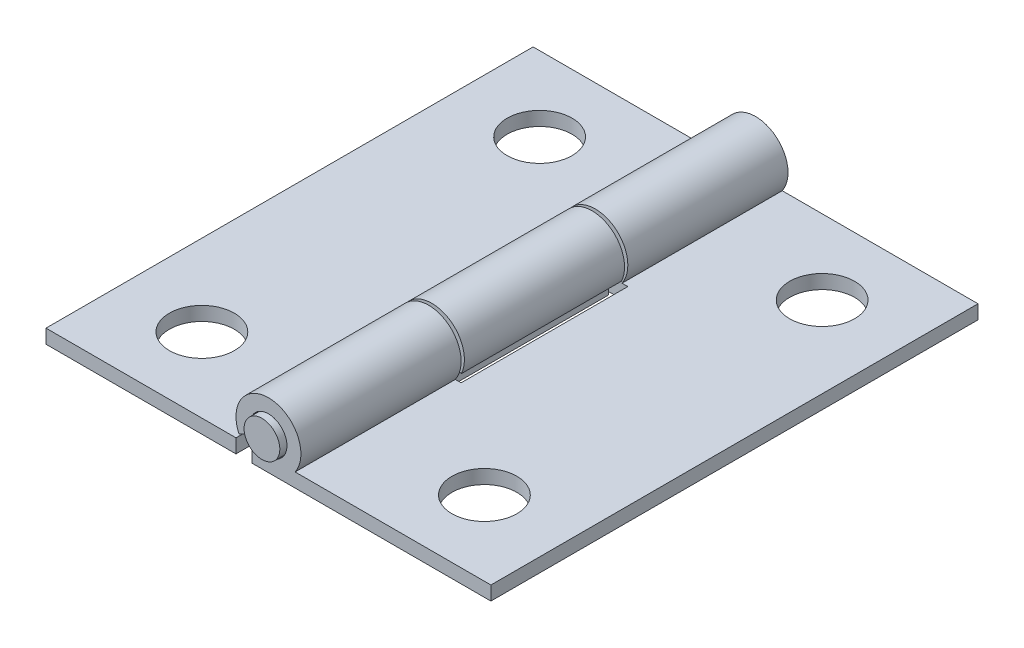
ISO-10303-21;
HEADER;
FILE_DESCRIPTION(('STEP AP214'),'2;1');
FILE_NAME('part.step','',(''),(''),'','','');
FILE_SCHEMA(('AUTOMOTIVE_DESIGN { 1 0 10303 214 1 1 1 1 }'));
ENDSEC;
DATA;
#1=APPLICATION_CONTEXT('core data for automotive mechanical design processes');
#2=APPLICATION_PROTOCOL_DEFINITION('international standard','automotive_design',2000,#1);
#3=PRODUCT_CONTEXT('',#1,'mechanical');
#4=PRODUCT('Part','Part','',(#3));
#5=PRODUCT_RELATED_PRODUCT_CATEGORY('part','',(#4));
#6=PRODUCT_DEFINITION_FORMATION('','',#4);
#7=PRODUCT_DEFINITION_CONTEXT('part definition',#1,'design');
#8=PRODUCT_DEFINITION('design','',#6,#7);
#9=PRODUCT_DEFINITION_SHAPE('','',#8);
#10=(LENGTH_UNIT() NAMED_UNIT(*) SI_UNIT(.MILLI.,.METRE.));
#11=(NAMED_UNIT(*) PLANE_ANGLE_UNIT() SI_UNIT($,.RADIAN.));
#12=(NAMED_UNIT(*) SI_UNIT($,.STERADIAN.) SOLID_ANGLE_UNIT());
#13=UNCERTAINTY_MEASURE_WITH_UNIT(LENGTH_MEASURE(1.E-05),#10,'distance_accuracy_value','');
#14=(GEOMETRIC_REPRESENTATION_CONTEXT(3) GLOBAL_UNCERTAINTY_ASSIGNED_CONTEXT((#13)) GLOBAL_UNIT_ASSIGNED_CONTEXT((#10,
#11,#12)) REPRESENTATION_CONTEXT('',''));
#15=CARTESIAN_POINT('',(0.,0.,0.));
#16=DIRECTION('',(0.,0.,1.));
#17=DIRECTION('',(1.,0.,0.));
#18=AXIS2_PLACEMENT_3D('',#15,#16,#17);
#19=CARTESIAN_POINT('',(0.,1.0922,0.));
#20=DIRECTION('',(0.,1.,0.));
#21=DIRECTION('',(0.,0.,1.));
#22=AXIS2_PLACEMENT_3D('',#19,#20,#21);
#23=PLANE('',#22);
#24=DIRECTION('',(1.,0.,0.));
#25=VECTOR('',#24,1.);
#26=CARTESIAN_POINT('',(0.,1.0922,-25.3153333333333));
#27=LINE('',#26,#25);
#28=CARTESIAN_POINT('',(17.399,1.0922,-25.3153333333333));
#29=VERTEX_POINT('',#28);
#30=CARTESIAN_POINT('',(18.669,1.0922,-25.3153333333333));
#31=VERTEX_POINT('',#30);
#32=EDGE_CURVE('E276',#29,#31,#27,.T.);
#33=ORIENTED_EDGE('',*,*,#32,.F.);
#34=DIRECTION('',(0.,0.,1.));
#35=VECTOR('',#34,1.);
#36=CARTESIAN_POINT('',(17.399,1.0922,-31.7735799096108));
#37=LINE('',#36,#35);
#38=CARTESIAN_POINT('',(17.399,1.0922,-12.7846666666667));
#39=VERTEX_POINT('',#38);
#40=EDGE_CURVE('E274',#29,#39,#37,.T.);
#41=ORIENTED_EDGE('',*,*,#40,.T.);
#42=DIRECTION('',(-1.,0.,0.));
#43=VECTOR('',#42,1.);
#44=CARTESIAN_POINT('',(0.,1.0922,-12.7846666666667));
#45=LINE('',#44,#43);
#46=CARTESIAN_POINT('',(18.669,1.0922,-12.7846666666667));
#47=VERTEX_POINT('',#46);
#48=EDGE_CURVE('E271',#47,#39,#45,.T.);
#49=ORIENTED_EDGE('',*,*,#48,.F.);
#50=DIRECTION('',(0.,0.,1.));
#51=VECTOR('',#50,1.);
#52=CARTESIAN_POINT('',(18.669,1.0922,0.));
#53=LINE('',#52,#51);
#54=EDGE_CURVE('E268',#31,#47,#53,.T.);
#55=ORIENTED_EDGE('',*,*,#54,.F.);
#56=EDGE_LOOP('',(#33,#41,#49,#55));
#57=FACE_BOUND('',#56,.T.);
#58=ADVANCED_FACE('F101',(#57),#23,.T.);
#59=CARTESIAN_POINT('',(0.,1.0922,0.));
#60=DIRECTION('',(0.,0.,-1.));
#61=DIRECTION('',(-1.,0.,0.));
#62=AXIS2_PLACEMENT_3D('',#59,#60,#61);
#63=PLANE('',#62);
#64=DIRECTION('',(1.,0.,0.));
#65=VECTOR('',#64,1.);
#66=CARTESIAN_POINT('',(0.,0.,0.));
#67=LINE('',#66,#65);
#68=CARTESIAN_POINT('',(0.,0.,0.));
#69=VERTEX_POINT('',#68);
#70=CARTESIAN_POINT('',(14.859,0.,0.));
#71=VERTEX_POINT('',#70);
#72=EDGE_CURVE('E221',#69,#71,#67,.T.);
#73=ORIENTED_EDGE('',*,*,#72,.T.);
#74=DIRECTION('',(0.,-1.,0.));
#75=VECTOR('',#74,1.);
#76=CARTESIAN_POINT('',(14.859,1.0922,0.));
#77=LINE('',#76,#75);
#78=CARTESIAN_POINT('',(14.859,1.0922,0.));
#79=VERTEX_POINT('',#78);
#80=EDGE_CURVE('E13',#79,#71,#77,.T.);
#81=ORIENTED_EDGE('',*,*,#80,.F.);
#82=DIRECTION('',(1.,0.,0.));
#83=VECTOR('',#82,1.);
#84=CARTESIAN_POINT('',(0.,1.0922,0.));
#85=LINE('',#84,#83);
#86=CARTESIAN_POINT('',(0.,1.0922,0.));
#87=VERTEX_POINT('',#86);
#88=EDGE_CURVE('E278',#87,#79,#85,.T.);
#89=ORIENTED_EDGE('',*,*,#88,.F.);
#90=DIRECTION('',(0.,-1.,0.));
#91=VECTOR('',#90,1.);
#92=CARTESIAN_POINT('',(0.,1.0922,0.));
#93=LINE('',#92,#91);
#94=EDGE_CURVE('E125',#87,#69,#93,.T.);
#95=ORIENTED_EDGE('',*,*,#94,.T.);
#96=EDGE_LOOP('',(#73,#81,#89,#95));
#97=FACE_BOUND('',#96,.T.);
#98=ADVANCED_FACE('F328',(#97),#63,.F.);
#99=CARTESIAN_POINT('',(14.859,1.0922,0.));
#100=DIRECTION('',(-1.,0.,0.));
#101=DIRECTION('',(0.,0.,1.));
#102=AXIS2_PLACEMENT_3D('',#99,#100,#101);
#103=PLANE('',#102);
#104=DIRECTION('',(0.,0.,-1.));
#105=VECTOR('',#104,1.);
#106=CARTESIAN_POINT('',(14.859,0.,0.));
#107=LINE('',#106,#105);
#108=CARTESIAN_POINT('',(14.859,0.,-12.7846666666667));
#109=VERTEX_POINT('',#108);
#110=EDGE_CURVE('E223',#71,#109,#107,.T.);
#111=ORIENTED_EDGE('',*,*,#110,.T.);
#112=DIRECTION('',(0.,-1.,0.));
#113=VECTOR('',#112,1.);
#114=CARTESIAN_POINT('',(14.859,1.0922,-12.7846666666667));
#115=LINE('',#114,#113);
#116=CARTESIAN_POINT('',(14.859,1.0922,-12.7846666666667));
#117=VERTEX_POINT('',#116);
#118=EDGE_CURVE('E109',#117,#109,#115,.T.);
#119=ORIENTED_EDGE('',*,*,#118,.F.);
#120=DIRECTION('',(0.,0.,-1.));
#121=VECTOR('',#120,1.);
#122=CARTESIAN_POINT('',(14.859,1.0922,0.));
#123=LINE('',#122,#121);
#124=EDGE_CURVE('E164',#79,#117,#123,.T.);
#125=ORIENTED_EDGE('',*,*,#124,.F.);
#126=ORIENTED_EDGE('',*,*,#80,.T.);
#127=EDGE_LOOP('',(#111,#119,#125,#126));
#128=FACE_BOUND('',#127,.T.);
#129=ADVANCED_FACE('F256',(#128),#103,.F.);
#130=CARTESIAN_POINT('',(0.,1.0922,-12.7846666666667));
#131=DIRECTION('',(0.,0.,1.));
#132=DIRECTION('',(1.,0.,0.));
#133=AXIS2_PLACEMENT_3D('',#130,#131,#132);
#134=PLANE('',#133);
#135=DIRECTION('',(-1.,0.,0.));
#136=VECTOR('',#135,1.);
#137=CARTESIAN_POINT('',(0.,0.,-12.7846666666667));
#138=LINE('',#137,#136);
#139=CARTESIAN_POINT('',(18.669,0.,-12.7846666666667));
#140=VERTEX_POINT('',#139);
#141=EDGE_CURVE('E226',#140,#109,#138,.T.);
#142=ORIENTED_EDGE('',*,*,#141,.F.);
#143=DIRECTION('',(0.,-1.,0.));
#144=VECTOR('',#143,1.);
#145=CARTESIAN_POINT('',(18.669,1.0922,-12.7846666666667));
#146=LINE('',#145,#144);
#147=EDGE_CURVE('E249',#47,#140,#146,.T.);
#148=ORIENTED_EDGE('',*,*,#147,.F.);
#149=ORIENTED_EDGE('',*,*,#48,.T.);
#150=CARTESIAN_POINT('',(17.399,2.54,-12.7846666666667));
#151=DIRECTION('',(0.,0.,1.));
#152=DIRECTION('',(1.,0.,0.));
#153=AXIS2_PLACEMENT_3D('',#150,#151,#152);
#154=CIRCLE('',#153,1.4478);
#155=CARTESIAN_POINT('',(18.7111524140717,1.92813328065182,-12.7846666666667));
#156=VERTEX_POINT('',#155);
#157=EDGE_CURVE('E116',#156,#39,#154,.T.);
#158=ORIENTED_EDGE('',*,*,#157,.F.);
#159=DIRECTION('',(0.906307787036649,-0.422618261740701,0.));
#160=VECTOR('',#159,1.);
#161=CARTESIAN_POINT('',(3.6621087619058,8.94561758356565,-12.7846666666667));
#162=LINE('',#161,#160);
#163=CARTESIAN_POINT('',(19.7010217790731,1.46654961517862,-12.7846666666667));
#164=VERTEX_POINT('',#163);
#165=EDGE_CURVE('E298',#156,#164,#162,.T.);
#166=ORIENTED_EDGE('',*,*,#165,.T.);
#167=CARTESIAN_POINT('',(17.399,2.54,-12.7846666666667));
#168=DIRECTION('',(0.,0.,1.));
#169=DIRECTION('',(1.,0.,0.));
#170=AXIS2_PLACEMENT_3D('',#167,#168,#169);
#171=CIRCLE('',#170,2.54);
#172=CARTESIAN_POINT('',(15.3120224821527,1.0922,-12.7846666666667));
#173=VERTEX_POINT('',#172);
#174=EDGE_CURVE('E301',#164,#173,#171,.T.);
#175=ORIENTED_EDGE('',*,*,#174,.T.);
#176=EDGE_CURVE('E255',#173,#117,#45,.T.);
#177=ORIENTED_EDGE('',*,*,#176,.T.);
#178=ORIENTED_EDGE('',*,*,#118,.T.);
#179=EDGE_LOOP('',(#142,#148,#149,#158,#166,#175,#177,#178));
#180=FACE_BOUND('',#179,.T.);
#181=ADVANCED_FACE('F252',(#180),#134,.T.);
#182=CARTESIAN_POINT('',(18.669,1.0922,0.));
#183=DIRECTION('',(1.,0.,0.));
#184=DIRECTION('',(0.,0.,-1.));
#185=AXIS2_PLACEMENT_3D('',#182,#183,#184);
#186=PLANE('',#185);
#187=DIRECTION('',(0.,0.,1.));
#188=VECTOR('',#187,1.);
#189=CARTESIAN_POINT('',(18.669,0.,0.));
#190=LINE('',#189,#188);
#191=CARTESIAN_POINT('',(18.669,0.,-25.3153333333333));
#192=VERTEX_POINT('',#191);
#193=EDGE_CURVE('E229',#192,#140,#190,.T.);
#194=ORIENTED_EDGE('',*,*,#193,.F.);
#195=DIRECTION('',(0.,-1.,0.));
#196=VECTOR('',#195,1.);
#197=CARTESIAN_POINT('',(18.669,1.0922,-25.3153333333333));
#198=LINE('',#197,#196);
#199=EDGE_CURVE('E247',#31,#192,#198,.T.);
#200=ORIENTED_EDGE('',*,*,#199,.F.);
#201=ORIENTED_EDGE('',*,*,#54,.T.);
#202=ORIENTED_EDGE('',*,*,#147,.T.);
#203=EDGE_LOOP('',(#194,#200,#201,#202));
#204=FACE_BOUND('',#203,.T.);
#205=ADVANCED_FACE('F265',(#204),#186,.T.);
#206=CARTESIAN_POINT('',(0.,1.0922,-25.3153333333333));
#207=DIRECTION('',(0.,0.,-1.));
#208=DIRECTION('',(-1.,0.,0.));
#209=AXIS2_PLACEMENT_3D('',#206,#207,#208);
#210=PLANE('',#209);
#211=DIRECTION('',(1.,0.,0.));
#212=VECTOR('',#211,1.);
#213=CARTESIAN_POINT('',(0.,0.,-25.3153333333333));
#214=LINE('',#213,#212);
#215=CARTESIAN_POINT('',(14.859,0.,-25.3153333333333));
#216=VERTEX_POINT('',#215);
#217=EDGE_CURVE('E232',#216,#192,#214,.T.);
#218=ORIENTED_EDGE('',*,*,#217,.F.);
#219=DIRECTION('',(0.,-1.,0.));
#220=VECTOR('',#219,1.);
#221=CARTESIAN_POINT('',(14.859,1.0922,-25.3153333333333));
#222=LINE('',#221,#220);
#223=CARTESIAN_POINT('',(14.859,1.0922,-25.3153333333333));
#224=VERTEX_POINT('',#223);
#225=EDGE_CURVE('E205',#224,#216,#222,.T.);
#226=ORIENTED_EDGE('',*,*,#225,.F.);
#227=CARTESIAN_POINT('',(15.3120224821527,1.0922,-25.3153333333333));
#228=VERTEX_POINT('',#227);
#229=EDGE_CURVE('E194',#224,#228,#27,.T.);
#230=ORIENTED_EDGE('',*,*,#229,.T.);
#231=CARTESIAN_POINT('',(17.399,2.54,-25.3153333333333));
#232=DIRECTION('',(0.,0.,-1.));
#233=DIRECTION('',(-1.,0.,0.));
#234=AXIS2_PLACEMENT_3D('',#231,#232,#233);
#235=CIRCLE('',#234,2.54);
#236=CARTESIAN_POINT('',(19.7010217790731,1.46654961517862,-25.3153333333333));
#237=VERTEX_POINT('',#236);
#238=EDGE_CURVE('E287',#237,#228,#235,.F.);
#239=ORIENTED_EDGE('',*,*,#238,.F.);
#240=DIRECTION('',(0.906307787036649,-0.422618261740701,0.));
#241=VECTOR('',#240,1.);
#242=CARTESIAN_POINT('',(3.6621087619058,8.94561758356565,-25.3153333333333));
#243=LINE('',#242,#241);
#244=CARTESIAN_POINT('',(18.7111524140717,1.92813328065182,-25.3153333333333));
#245=VERTEX_POINT('',#244);
#246=EDGE_CURVE('E288',#245,#237,#243,.T.);
#247=ORIENTED_EDGE('',*,*,#246,.F.);
#248=CARTESIAN_POINT('',(17.399,2.54,-25.3153333333333));
#249=DIRECTION('',(0.,0.,-1.));
#250=DIRECTION('',(-1.,0.,0.));
#251=AXIS2_PLACEMENT_3D('',#248,#249,#250);
#252=CIRCLE('',#251,1.4478);
#253=EDGE_CURVE('E295',#245,#29,#252,.F.);
#254=ORIENTED_EDGE('',*,*,#253,.T.);
#255=ORIENTED_EDGE('',*,*,#32,.T.);
#256=ORIENTED_EDGE('',*,*,#199,.T.);
#257=EDGE_LOOP('',(#218,#226,#230,#239,#247,#254,#255,#256));
#258=FACE_BOUND('',#257,.T.);
#259=ADVANCED_FACE('F326',(#258),#210,.T.);
#260=CARTESIAN_POINT('',(14.859,0.,-38.1));
#261=VERTEX_POINT('',#260);
#262=EDGE_CURVE('E201',#216,#261,#107,.T.);
#263=ORIENTED_EDGE('',*,*,#262,.T.);
#264=DIRECTION('',(0.,-1.,0.));
#265=VECTOR('',#264,1.);
#266=CARTESIAN_POINT('',(14.859,1.0922,-38.1));
#267=LINE('',#266,#265);
#268=CARTESIAN_POINT('',(14.859,1.0922,-38.1));
#269=VERTEX_POINT('',#268);
#270=EDGE_CURVE('E198',#269,#261,#267,.T.);
#271=ORIENTED_EDGE('',*,*,#270,.F.);
#272=EDGE_CURVE('E185',#224,#269,#123,.T.);
#273=ORIENTED_EDGE('',*,*,#272,.F.);
#274=ORIENTED_EDGE('',*,*,#225,.T.);
#275=EDGE_LOOP('',(#263,#271,#273,#274));
#276=FACE_BOUND('',#275,.T.);
#277=ADVANCED_FACE('F199',(#276),#103,.F.);
#278=CARTESIAN_POINT('',(0.,1.0922,-38.1));
#279=DIRECTION('',(0.,0.,-1.));
#280=DIRECTION('',(-1.,0.,0.));
#281=AXIS2_PLACEMENT_3D('',#278,#279,#280);
#282=PLANE('',#281);
#283=DIRECTION('',(1.,0.,0.));
#284=VECTOR('',#283,1.);
#285=CARTESIAN_POINT('',(0.,0.,-38.1));
#286=LINE('',#285,#284);
#287=CARTESIAN_POINT('',(0.,0.,-38.1));
#288=VERTEX_POINT('',#287);
#289=EDGE_CURVE('E235',#288,#261,#286,.T.);
#290=ORIENTED_EDGE('',*,*,#289,.F.);
#291=DIRECTION('',(0.,-1.,0.));
#292=VECTOR('',#291,1.);
#293=CARTESIAN_POINT('',(0.,1.0922,-38.1));
#294=LINE('',#293,#292);
#295=CARTESIAN_POINT('',(0.,1.0922,-38.1));
#296=VERTEX_POINT('',#295);
#297=EDGE_CURVE('E206',#296,#288,#294,.T.);
#298=ORIENTED_EDGE('',*,*,#297,.F.);
#299=DIRECTION('',(1.,0.,0.));
#300=VECTOR('',#299,1.);
#301=CARTESIAN_POINT('',(0.,1.0922,-38.1));
#302=LINE('',#301,#300);
#303=EDGE_CURVE('E192',#296,#269,#302,.T.);
#304=ORIENTED_EDGE('',*,*,#303,.T.);
#305=ORIENTED_EDGE('',*,*,#270,.T.);
#306=EDGE_LOOP('',(#290,#298,#304,#305));
#307=FACE_BOUND('',#306,.T.);
#308=ADVANCED_FACE('F208',(#307),#282,.T.);
#309=CARTESIAN_POINT('',(0.,1.0922,0.));
#310=DIRECTION('',(-1.,0.,0.));
#311=DIRECTION('',(0.,0.,1.));
#312=AXIS2_PLACEMENT_3D('',#309,#310,#311);
#313=PLANE('',#312);
#314=DIRECTION('',(0.,0.,-1.));
#315=VECTOR('',#314,1.);
#316=CARTESIAN_POINT('',(0.,0.,0.));
#317=LINE('',#316,#315);
#318=EDGE_CURVE('E237',#69,#288,#317,.T.);
#319=ORIENTED_EDGE('',*,*,#318,.F.);
#320=ORIENTED_EDGE('',*,*,#94,.F.);
#321=DIRECTION('',(0.,0.,-1.));
#322=VECTOR('',#321,1.);
#323=CARTESIAN_POINT('',(0.,1.0922,0.));
#324=LINE('',#323,#322);
#325=EDGE_CURVE('E209',#87,#296,#324,.T.);
#326=ORIENTED_EDGE('',*,*,#325,.T.);
#327=ORIENTED_EDGE('',*,*,#297,.T.);
#328=EDGE_LOOP('',(#319,#320,#326,#327));
#329=FACE_BOUND('',#328,.T.);
#330=ADVANCED_FACE('F329',(#329),#313,.T.);
#331=CARTESIAN_POINT('',(6.35,1.0922,-5.842));
#332=DIRECTION('',(0.,-1.,0.));
#333=DIRECTION('',(0.,0.,-1.));
#334=AXIS2_PLACEMENT_3D('',#331,#332,#333);
#335=CYLINDRICAL_SURFACE('',#334,2.54);
#336=CARTESIAN_POINT('',(6.35,1.0922,-5.842));
#337=DIRECTION('',(0.,1.,0.));
#338=DIRECTION('',(0.,0.,1.));
#339=AXIS2_PLACEMENT_3D('',#336,#337,#338);
#340=CIRCLE('',#339,2.54);
#341=CARTESIAN_POINT('',(6.35,1.0922,-3.302));
#342=VERTEX_POINT('',#341);
#343=EDGE_CURVE('E243',#342,#342,#340,.F.);
#344=ORIENTED_EDGE('',*,*,#343,.F.);
#345=EDGE_LOOP('',(#344));
#346=FACE_BOUND('',#345,.T.);
#347=CARTESIAN_POINT('',(6.35,0.,-5.842));
#348=DIRECTION('',(0.,1.,0.));
#349=DIRECTION('',(0.,0.,1.));
#350=AXIS2_PLACEMENT_3D('',#347,#348,#349);
#351=CIRCLE('',#350,2.54);
#352=CARTESIAN_POINT('',(6.35,0.,-3.302));
#353=VERTEX_POINT('',#352);
#354=EDGE_CURVE('E218',#353,#353,#351,.F.);
#355=ORIENTED_EDGE('',*,*,#354,.T.);
#356=EDGE_LOOP('',(#355));
#357=FACE_BOUND('',#356,.T.);
#358=ADVANCED_FACE('F103',(#346,#357),#335,.F.);
#359=CARTESIAN_POINT('',(6.35,1.0922,-32.258));
#360=DIRECTION('',(0.,-1.,0.));
#361=DIRECTION('',(0.,0.,-1.));
#362=AXIS2_PLACEMENT_3D('',#359,#360,#361);
#363=CYLINDRICAL_SURFACE('',#362,2.54);
#364=CARTESIAN_POINT('',(6.35,1.0922,-32.258));
#365=DIRECTION('',(0.,1.,0.));
#366=DIRECTION('',(0.,0.,1.));
#367=AXIS2_PLACEMENT_3D('',#364,#365,#366);
#368=CIRCLE('',#367,2.54);
#369=CARTESIAN_POINT('',(6.35,1.0922,-29.718));
#370=VERTEX_POINT('',#369);
#371=EDGE_CURVE('E211',#370,#370,#368,.F.);
#372=ORIENTED_EDGE('',*,*,#371,.F.);
#373=EDGE_LOOP('',(#372));
#374=FACE_BOUND('',#373,.T.);
#375=CARTESIAN_POINT('',(6.35,0.,-32.258));
#376=DIRECTION('',(0.,1.,0.));
#377=DIRECTION('',(0.,0.,1.));
#378=AXIS2_PLACEMENT_3D('',#375,#376,#377);
#379=CIRCLE('',#378,2.54);
#380=CARTESIAN_POINT('',(6.35,0.,-29.718));
#381=VERTEX_POINT('',#380);
#382=EDGE_CURVE('E240',#381,#381,#379,.F.);
#383=ORIENTED_EDGE('',*,*,#382,.T.);
#384=EDGE_LOOP('',(#383));
#385=FACE_BOUND('',#384,.T.);
#386=ADVANCED_FACE('F345',(#374,#385),#363,.F.);
#387=DIRECTION('',(0.,0.,1.));
#388=VECTOR('',#387,1.);
#389=CARTESIAN_POINT('',(15.3120224821527,1.0922,-31.7735799096108));
#390=LINE('',#389,#388);
#391=EDGE_CURVE('E289',#228,#173,#390,.T.);
#392=ORIENTED_EDGE('',*,*,#391,.F.);
#393=ORIENTED_EDGE('',*,*,#229,.F.);
#394=ORIENTED_EDGE('',*,*,#272,.T.);
#395=ORIENTED_EDGE('',*,*,#303,.F.);
#396=ORIENTED_EDGE('',*,*,#325,.F.);
#397=ORIENTED_EDGE('',*,*,#88,.T.);
#398=ORIENTED_EDGE('',*,*,#124,.T.);
#399=ORIENTED_EDGE('',*,*,#176,.F.);
#400=EDGE_LOOP('',(#392,#393,#394,#395,#396,#397,#398,#399));
#401=FACE_BOUND('',#400,.T.);
#402=ORIENTED_EDGE('',*,*,#343,.T.);
#403=EDGE_LOOP('',(#402));
#404=FACE_BOUND('',#403,.T.);
#405=ORIENTED_EDGE('',*,*,#371,.T.);
#406=EDGE_LOOP('',(#405));
#407=FACE_BOUND('',#406,.T.);
#408=ADVANCED_FACE('F188',(#401,#404,#407),#23,.T.);
#409=CARTESIAN_POINT('',(0.,0.,0.));
#410=DIRECTION('',(0.,1.,0.));
#411=DIRECTION('',(0.,0.,1.));
#412=AXIS2_PLACEMENT_3D('',#409,#410,#411);
#413=PLANE('',#412);
#414=ORIENTED_EDGE('',*,*,#354,.F.);
#415=EDGE_LOOP('',(#414));
#416=FACE_BOUND('',#415,.T.);
#417=ORIENTED_EDGE('',*,*,#72,.F.);
#418=ORIENTED_EDGE('',*,*,#318,.T.);
#419=ORIENTED_EDGE('',*,*,#289,.T.);
#420=ORIENTED_EDGE('',*,*,#262,.F.);
#421=ORIENTED_EDGE('',*,*,#217,.T.);
#422=ORIENTED_EDGE('',*,*,#193,.T.);
#423=ORIENTED_EDGE('',*,*,#141,.T.);
#424=ORIENTED_EDGE('',*,*,#110,.F.);
#425=EDGE_LOOP('',(#417,#418,#419,#420,#421,#422,#423,#424));
#426=FACE_BOUND('',#425,.T.);
#427=ORIENTED_EDGE('',*,*,#382,.F.);
#428=EDGE_LOOP('',(#427));
#429=FACE_BOUND('',#428,.T.);
#430=ADVANCED_FACE('F259',(#416,#426,#429),#413,.F.);
#431=CARTESIAN_POINT('',(3.6621087619058,8.94561758356565,-31.7735799096108));
#432=DIRECTION('',(-0.422618261740701,-0.906307787036649,0.));
#433=DIRECTION('',(0.906307787036649,-0.422618261740701,0.));
#434=AXIS2_PLACEMENT_3D('',#431,#432,#433);
#435=PLANE('',#434);
#436=DIRECTION('',(0.,0.,1.));
#437=VECTOR('',#436,1.);
#438=CARTESIAN_POINT('',(18.7111524140717,1.92813328065182,-31.7735799096108));
#439=LINE('',#438,#437);
#440=EDGE_CURVE('E282',#245,#156,#439,.T.);
#441=ORIENTED_EDGE('',*,*,#440,.F.);
#442=ORIENTED_EDGE('',*,*,#246,.T.);
#443=DIRECTION('',(0.,0.,1.));
#444=VECTOR('',#443,1.);
#445=CARTESIAN_POINT('',(19.7010217790731,1.46654961517862,-31.7735799096108));
#446=LINE('',#445,#444);
#447=EDGE_CURVE('E284',#237,#164,#446,.T.);
#448=ORIENTED_EDGE('',*,*,#447,.T.);
#449=ORIENTED_EDGE('',*,*,#165,.F.);
#450=EDGE_LOOP('',(#441,#442,#448,#449));
#451=FACE_BOUND('',#450,.T.);
#452=ADVANCED_FACE('F313',(#451),#435,.T.);
#453=CARTESIAN_POINT('',(17.399,2.54,-31.7735799096108));
#454=DIRECTION('',(0.,0.,1.));
#455=DIRECTION('',(1.,0.,0.));
#456=AXIS2_PLACEMENT_3D('',#453,#454,#455);
#457=CYLINDRICAL_SURFACE('',#456,2.54);
#458=ORIENTED_EDGE('',*,*,#447,.F.);
#459=ORIENTED_EDGE('',*,*,#238,.T.);
#460=ORIENTED_EDGE('',*,*,#391,.T.);
#461=ORIENTED_EDGE('',*,*,#174,.F.);
#462=EDGE_LOOP('',(#458,#459,#460,#461));
#463=FACE_BOUND('',#462,.T.);
#464=ADVANCED_FACE('F327',(#463),#457,.T.);
#465=CARTESIAN_POINT('',(17.399,2.54,-31.7735799096108));
#466=DIRECTION('',(0.,0.,1.));
#467=DIRECTION('',(1.,0.,0.));
#468=AXIS2_PLACEMENT_3D('',#465,#466,#467);
#469=CYLINDRICAL_SURFACE('',#468,1.4478);
#470=ORIENTED_EDGE('',*,*,#253,.F.);
#471=ORIENTED_EDGE('',*,*,#440,.T.);
#472=ORIENTED_EDGE('',*,*,#157,.T.);
#473=ORIENTED_EDGE('',*,*,#40,.F.);
#474=EDGE_LOOP('',(#470,#471,#472,#473));
#475=FACE_BOUND('',#474,.T.);
#476=ADVANCED_FACE('F330',(#475),#469,.F.);
#477=CLOSED_SHELL('',(#58,#98,#129,#181,#205,#259,#277,#308,#330,#358,#386,#408,#430,#452,#464,#476));
#478=MANIFOLD_SOLID_BREP('B2',#477);
#479=CARTESIAN_POINT('',(0.,1.0922,0.));
#480=DIRECTION('',(0.,1.,0.));
#481=DIRECTION('',(0.,0.,1.));
#482=AXIS2_PLACEMENT_3D('',#479,#480,#481);
#483=PLANE('',#482);
#484=DIRECTION('',(1.,0.,0.));
#485=VECTOR('',#484,1.);
#486=CARTESIAN_POINT('',(0.,1.0922,-25.5693333333333));
#487=LINE('',#486,#485);
#488=CARTESIAN_POINT('',(16.129,1.0922,-25.5693333333333));
#489=VERTEX_POINT('',#488);
#490=CARTESIAN_POINT('',(17.399,1.0922,-25.5693333333333));
#491=VERTEX_POINT('',#490);
#492=EDGE_CURVE('E624',#489,#491,#487,.T.);
#493=ORIENTED_EDGE('',*,*,#492,.T.);
#494=DIRECTION('',(0.,0.,1.));
#495=VECTOR('',#494,1.);
#496=CARTESIAN_POINT('',(17.399,1.0922,-44.5582465762775));
#497=LINE('',#496,#495);
#498=CARTESIAN_POINT('',(17.399,1.0922,-38.1));
#499=VERTEX_POINT('',#498);
#500=EDGE_CURVE('E611',#499,#491,#497,.T.);
#501=ORIENTED_EDGE('',*,*,#500,.F.);
#502=DIRECTION('',(1.,0.,0.));
#503=VECTOR('',#502,1.);
#504=CARTESIAN_POINT('',(0.,1.0922,-38.1));
#505=LINE('',#504,#503);
#506=CARTESIAN_POINT('',(16.129,1.0922,-38.1));
#507=VERTEX_POINT('',#506);
#508=EDGE_CURVE('E623',#507,#499,#505,.T.);
#509=ORIENTED_EDGE('',*,*,#508,.F.);
#510=DIRECTION('',(0.,0.,1.));
#511=VECTOR('',#510,1.);
#512=CARTESIAN_POINT('',(16.129,1.0922,0.));
#513=LINE('',#512,#511);
#514=EDGE_CURVE('E630',#507,#489,#513,.T.);
#515=ORIENTED_EDGE('',*,*,#514,.T.);
#516=EDGE_LOOP('',(#493,#501,#509,#515));
#517=FACE_BOUND('',#516,.T.);
#518=ADVANCED_FACE('F495',(#517),#483,.T.);
#519=CARTESIAN_POINT('',(28.448,1.0922,-5.842));
#520=DIRECTION('',(0.,1.,0.));
#521=DIRECTION('',(0.,0.,1.));
#522=AXIS2_PLACEMENT_3D('',#519,#520,#521);
#523=CIRCLE('',#522,2.54);
#524=CARTESIAN_POINT('',(28.448,1.0922,-3.302));
#525=VERTEX_POINT('',#524);
#526=EDGE_CURVE('E686',#525,#525,#523,.T.);
#527=ORIENTED_EDGE('',*,*,#526,.F.);
#528=EDGE_LOOP('',(#527));
#529=FACE_BOUND('',#528,.T.);
#530=CARTESIAN_POINT('',(28.448,1.0922,-32.258));
#531=DIRECTION('',(0.,1.,0.));
#532=DIRECTION('',(0.,0.,1.));
#533=AXIS2_PLACEMENT_3D('',#530,#531,#532);
#534=CIRCLE('',#533,2.54);
#535=CARTESIAN_POINT('',(28.448,1.0922,-29.718));
#536=VERTEX_POINT('',#535);
#537=EDGE_CURVE('E770',#536,#536,#534,.T.);
#538=ORIENTED_EDGE('',*,*,#537,.F.);
#539=EDGE_LOOP('',(#538));
#540=FACE_BOUND('',#539,.T.);
#541=CARTESIAN_POINT('',(19.4859775178473,1.0922,-38.1));
#542=VERTEX_POINT('',#541);
#543=CARTESIAN_POINT('',(34.798,1.0922,-38.1));
#544=VERTEX_POINT('',#543);
#545=EDGE_CURVE('E631',#542,#544,#505,.T.);
#546=ORIENTED_EDGE('',*,*,#545,.F.);
#547=DIRECTION('',(0.,0.,1.));
#548=VECTOR('',#547,1.);
#549=CARTESIAN_POINT('',(19.4859775178473,1.0922,-44.5582465762775));
#550=LINE('',#549,#548);
#551=CARTESIAN_POINT('',(19.4859775178473,1.0922,-25.5693333333333));
#552=VERTEX_POINT('',#551);
#553=EDGE_CURVE('E625',#542,#552,#550,.T.);
#554=ORIENTED_EDGE('',*,*,#553,.T.);
#555=CARTESIAN_POINT('',(19.939,1.0922,-25.5693333333333));
#556=VERTEX_POINT('',#555);
#557=EDGE_CURVE('E633',#552,#556,#487,.T.);
#558=ORIENTED_EDGE('',*,*,#557,.T.);
#559=DIRECTION('',(0.,0.,1.));
#560=VECTOR('',#559,1.);
#561=CARTESIAN_POINT('',(19.939,1.0922,0.));
#562=LINE('',#561,#560);
#563=CARTESIAN_POINT('',(19.939,1.0922,-12.5306666666667));
#564=VERTEX_POINT('',#563);
#565=EDGE_CURVE('E640',#556,#564,#562,.T.);
#566=ORIENTED_EDGE('',*,*,#565,.T.);
#567=DIRECTION('',(1.,0.,0.));
#568=VECTOR('',#567,1.);
#569=CARTESIAN_POINT('',(0.,1.0922,-12.5306666666667));
#570=LINE('',#569,#568);
#571=CARTESIAN_POINT('',(19.4859775178473,1.0922,-12.5306666666667));
#572=VERTEX_POINT('',#571);
#573=EDGE_CURVE('E643',#572,#564,#570,.T.);
#574=ORIENTED_EDGE('',*,*,#573,.F.);
#575=DIRECTION('',(0.,0.,1.));
#576=VECTOR('',#575,1.);
#577=CARTESIAN_POINT('',(19.4859775178473,1.0922,-18.9889132429442));
#578=LINE('',#577,#576);
#579=CARTESIAN_POINT('',(19.4859775178473,1.0922,0.));
#580=VERTEX_POINT('',#579);
#581=EDGE_CURVE('E755',#572,#580,#578,.T.);
#582=ORIENTED_EDGE('',*,*,#581,.T.);
#583=DIRECTION('',(1.,0.,0.));
#584=VECTOR('',#583,1.);
#585=CARTESIAN_POINT('',(0.,1.0922,0.));
#586=LINE('',#585,#584);
#587=CARTESIAN_POINT('',(34.798,1.0922,0.));
#588=VERTEX_POINT('',#587);
#589=EDGE_CURVE('E650',#580,#588,#586,.T.);
#590=ORIENTED_EDGE('',*,*,#589,.T.);
#591=DIRECTION('',(0.,0.,1.));
#592=VECTOR('',#591,1.);
#593=CARTESIAN_POINT('',(34.798,1.0922,0.));
#594=LINE('',#593,#592);
#595=EDGE_CURVE('E635',#544,#588,#594,.T.);
#596=ORIENTED_EDGE('',*,*,#595,.F.);
#597=EDGE_LOOP('',(#546,#554,#558,#566,#574,#582,#590,#596));
#598=FACE_BOUND('',#597,.T.);
#599=ADVANCED_FACE('F775',(#529,#540,#598),#483,.T.);
#600=DIRECTION('',(0.,0.,1.));
#601=VECTOR('',#600,1.);
#602=CARTESIAN_POINT('',(17.399,1.0922,-18.9889132429442));
#603=LINE('',#602,#601);
#604=CARTESIAN_POINT('',(17.399,1.0922,-12.5306666666667));
#605=VERTEX_POINT('',#604);
#606=CARTESIAN_POINT('',(17.399,1.0922,0.));
#607=VERTEX_POINT('',#606);
#608=EDGE_CURVE('E746',#605,#607,#603,.T.);
#609=ORIENTED_EDGE('',*,*,#608,.F.);
#610=CARTESIAN_POINT('',(16.129,1.0922,-12.5306666666667));
#611=VERTEX_POINT('',#610);
#612=EDGE_CURVE('E644',#611,#605,#570,.T.);
#613=ORIENTED_EDGE('',*,*,#612,.F.);
#614=DIRECTION('',(0.,0.,-1.));
#615=VECTOR('',#614,1.);
#616=CARTESIAN_POINT('',(16.129,1.0922,0.));
#617=LINE('',#616,#615);
#618=CARTESIAN_POINT('',(16.129,1.0922,0.));
#619=VERTEX_POINT('',#618);
#620=EDGE_CURVE('E647',#619,#611,#617,.T.);
#621=ORIENTED_EDGE('',*,*,#620,.F.);
#622=EDGE_CURVE('E651',#619,#607,#586,.T.);
#623=ORIENTED_EDGE('',*,*,#622,.T.);
#624=EDGE_LOOP('',(#609,#613,#621,#623));
#625=FACE_BOUND('',#624,.T.);
#626=ADVANCED_FACE('F793',(#625),#483,.T.);
#627=CARTESIAN_POINT('',(34.798,1.0922,0.));
#628=DIRECTION('',(1.,0.,0.));
#629=DIRECTION('',(0.,0.,-1.));
#630=AXIS2_PLACEMENT_3D('',#627,#628,#629);
#631=PLANE('',#630);
#632=DIRECTION('',(0.,0.,1.));
#633=VECTOR('',#632,1.);
#634=CARTESIAN_POINT('',(34.798,0.,0.));
#635=LINE('',#634,#633);
#636=CARTESIAN_POINT('',(34.798,0.,-38.1));
#637=VERTEX_POINT('',#636);
#638=CARTESIAN_POINT('',(34.798,0.,0.));
#639=VERTEX_POINT('',#638);
#640=EDGE_CURVE('E662',#637,#639,#635,.T.);
#641=ORIENTED_EDGE('',*,*,#640,.F.);
#642=DIRECTION('',(0.,-1.,0.));
#643=VECTOR('',#642,1.);
#644=CARTESIAN_POINT('',(34.798,1.0922,-38.1));
#645=LINE('',#644,#643);
#646=EDGE_CURVE('E99',#544,#637,#645,.T.);
#647=ORIENTED_EDGE('',*,*,#646,.F.);
#648=ORIENTED_EDGE('',*,*,#595,.T.);
#649=DIRECTION('',(0.,-1.,0.));
#650=VECTOR('',#649,1.);
#651=CARTESIAN_POINT('',(34.798,1.0922,0.));
#652=LINE('',#651,#650);
#653=EDGE_CURVE('E654',#588,#639,#652,.T.);
#654=ORIENTED_EDGE('',*,*,#653,.T.);
#655=EDGE_LOOP('',(#641,#647,#648,#654));
#656=FACE_BOUND('',#655,.T.);
#657=ADVANCED_FACE('F711',(#656),#631,.T.);
#658=CARTESIAN_POINT('',(0.,1.0922,-38.1));
#659=DIRECTION('',(0.,0.,-1.));
#660=DIRECTION('',(-1.,0.,0.));
#661=AXIS2_PLACEMENT_3D('',#658,#659,#660);
#662=PLANE('',#661);
#663=DIRECTION('',(1.,0.,0.));
#664=VECTOR('',#663,1.);
#665=CARTESIAN_POINT('',(0.,0.,-38.1));
#666=LINE('',#665,#664);
#667=CARTESIAN_POINT('',(16.129,0.,-38.1));
#668=VERTEX_POINT('',#667);
#669=EDGE_CURVE('E665',#668,#637,#666,.T.);
#670=ORIENTED_EDGE('',*,*,#669,.F.);
#671=DIRECTION('',(0.,-1.,0.));
#672=VECTOR('',#671,1.);
#673=CARTESIAN_POINT('',(16.129,1.0922,-38.1));
#674=LINE('',#673,#672);
#675=EDGE_CURVE('E503',#507,#668,#674,.T.);
#676=ORIENTED_EDGE('',*,*,#675,.F.);
#677=ORIENTED_EDGE('',*,*,#508,.T.);
#678=CARTESIAN_POINT('',(17.399,2.54,-38.1));
#679=DIRECTION('',(0.,0.,-1.));
#680=DIRECTION('',(-1.,0.,0.));
#681=AXIS2_PLACEMENT_3D('',#678,#679,#680);
#682=CIRCLE('',#681,1.4478);
#683=CARTESIAN_POINT('',(16.0868475859283,1.92813328065182,-38.1));
#684=VERTEX_POINT('',#683);
#685=EDGE_CURVE('E607',#684,#499,#682,.T.);
#686=ORIENTED_EDGE('',*,*,#685,.F.);
#687=DIRECTION('',(0.906307787036649,0.422618261740701,0.));
#688=VECTOR('',#687,1.);
#689=CARTESIAN_POINT('',(2.55302961715814,-4.38278968226148,-38.1));
#690=LINE('',#689,#688);
#691=CARTESIAN_POINT('',(15.0969782209269,1.46654961517862,-38.1));
#692=VERTEX_POINT('',#691);
#693=EDGE_CURVE('E739',#692,#684,#690,.T.);
#694=ORIENTED_EDGE('',*,*,#693,.F.);
#695=CARTESIAN_POINT('',(17.399,2.54,-38.1));
#696=DIRECTION('',(0.,0.,-1.));
#697=DIRECTION('',(-1.,0.,0.));
#698=AXIS2_PLACEMENT_3D('',#695,#696,#697);
#699=CIRCLE('',#698,2.54);
#700=EDGE_CURVE('E735',#692,#542,#699,.T.);
#701=ORIENTED_EDGE('',*,*,#700,.T.);
#702=ORIENTED_EDGE('',*,*,#545,.T.);
#703=ORIENTED_EDGE('',*,*,#646,.T.);
#704=EDGE_LOOP('',(#670,#676,#677,#686,#694,#701,#702,#703));
#705=FACE_BOUND('',#704,.T.);
#706=ADVANCED_FACE('F628',(#705),#662,.T.);
#707=CARTESIAN_POINT('',(16.129,1.0922,0.));
#708=DIRECTION('',(1.,0.,0.));
#709=DIRECTION('',(0.,0.,-1.));
#710=AXIS2_PLACEMENT_3D('',#707,#708,#709);
#711=PLANE('',#710);
#712=DIRECTION('',(0.,0.,1.));
#713=VECTOR('',#712,1.);
#714=CARTESIAN_POINT('',(16.129,0.,0.));
#715=LINE('',#714,#713);
#716=CARTESIAN_POINT('',(16.129,0.,-25.5693333333333));
#717=VERTEX_POINT('',#716);
#718=EDGE_CURVE('E668',#668,#717,#715,.T.);
#719=ORIENTED_EDGE('',*,*,#718,.T.);
#720=DIRECTION('',(0.,-1.,0.));
#721=VECTOR('',#720,1.);
#722=CARTESIAN_POINT('',(16.129,1.0922,-25.5693333333333));
#723=LINE('',#722,#721);
#724=EDGE_CURVE('E697',#489,#717,#723,.T.);
#725=ORIENTED_EDGE('',*,*,#724,.F.);
#726=ORIENTED_EDGE('',*,*,#514,.F.);
#727=ORIENTED_EDGE('',*,*,#675,.T.);
#728=EDGE_LOOP('',(#719,#725,#726,#727));
#729=FACE_BOUND('',#728,.T.);
#730=ADVANCED_FACE('F701',(#729),#711,.F.);
#731=CARTESIAN_POINT('',(0.,1.0922,-25.5693333333333));
#732=DIRECTION('',(0.,0.,-1.));
#733=DIRECTION('',(-1.,0.,0.));
#734=AXIS2_PLACEMENT_3D('',#731,#732,#733);
#735=PLANE('',#734);
#736=DIRECTION('',(1.,0.,0.));
#737=VECTOR('',#736,1.);
#738=CARTESIAN_POINT('',(0.,0.,-25.5693333333333));
#739=LINE('',#738,#737);
#740=CARTESIAN_POINT('',(19.939,0.,-25.5693333333333));
#741=VERTEX_POINT('',#740);
#742=EDGE_CURVE('E671',#717,#741,#739,.T.);
#743=ORIENTED_EDGE('',*,*,#742,.T.);
#744=DIRECTION('',(0.,-1.,0.));
#745=VECTOR('',#744,1.);
#746=CARTESIAN_POINT('',(19.939,1.0922,-25.5693333333333));
#747=LINE('',#746,#745);
#748=EDGE_CURVE('E694',#556,#741,#747,.T.);
#749=ORIENTED_EDGE('',*,*,#748,.F.);
#750=ORIENTED_EDGE('',*,*,#557,.F.);
#751=CARTESIAN_POINT('',(17.399,2.54,-25.5693333333333));
#752=DIRECTION('',(0.,0.,-1.));
#753=DIRECTION('',(-1.,0.,0.));
#754=AXIS2_PLACEMENT_3D('',#751,#752,#753);
#755=CIRCLE('',#754,2.54);
#756=CARTESIAN_POINT('',(15.0969782209269,1.46654961517862,-25.5693333333333));
#757=VERTEX_POINT('',#756);
#758=EDGE_CURVE('E510',#757,#552,#755,.T.);
#759=ORIENTED_EDGE('',*,*,#758,.F.);
#760=DIRECTION('',(0.906307787036649,0.422618261740701,0.));
#761=VECTOR('',#760,1.);
#762=CARTESIAN_POINT('',(2.55302961715814,-4.38278968226148,-25.5693333333333));
#763=LINE('',#762,#761);
#764=CARTESIAN_POINT('',(16.0868475859283,1.92813328065182,-25.5693333333333));
#765=VERTEX_POINT('',#764);
#766=EDGE_CURVE('E733',#757,#765,#763,.T.);
#767=ORIENTED_EDGE('',*,*,#766,.T.);
#768=CARTESIAN_POINT('',(17.399,2.54,-25.5693333333333));
#769=DIRECTION('',(0.,0.,-1.));
#770=DIRECTION('',(-1.,0.,0.));
#771=AXIS2_PLACEMENT_3D('',#768,#769,#770);
#772=CIRCLE('',#771,1.4478);
#773=EDGE_CURVE('E617',#765,#491,#772,.T.);
#774=ORIENTED_EDGE('',*,*,#773,.T.);
#775=ORIENTED_EDGE('',*,*,#492,.F.);
#776=ORIENTED_EDGE('',*,*,#724,.T.);
#777=EDGE_LOOP('',(#743,#749,#750,#759,#767,#774,#775,#776));
#778=FACE_BOUND('',#777,.T.);
#779=ADVANCED_FACE('F730',(#778),#735,.F.);
#780=CARTESIAN_POINT('',(19.939,1.0922,0.));
#781=DIRECTION('',(1.,0.,0.));
#782=DIRECTION('',(0.,0.,-1.));
#783=AXIS2_PLACEMENT_3D('',#780,#781,#782);
#784=PLANE('',#783);
#785=DIRECTION('',(0.,0.,1.));
#786=VECTOR('',#785,1.);
#787=CARTESIAN_POINT('',(19.939,0.,0.));
#788=LINE('',#787,#786);
#789=CARTESIAN_POINT('',(19.939,0.,-12.5306666666667));
#790=VERTEX_POINT('',#789);
#791=EDGE_CURVE('E674',#741,#790,#788,.T.);
#792=ORIENTED_EDGE('',*,*,#791,.T.);
#793=DIRECTION('',(0.,-1.,0.));
#794=VECTOR('',#793,1.);
#795=CARTESIAN_POINT('',(19.939,1.0922,-12.5306666666667));
#796=LINE('',#795,#794);
#797=EDGE_CURVE('E692',#564,#790,#796,.T.);
#798=ORIENTED_EDGE('',*,*,#797,.F.);
#799=ORIENTED_EDGE('',*,*,#565,.F.);
#800=ORIENTED_EDGE('',*,*,#748,.T.);
#801=EDGE_LOOP('',(#792,#798,#799,#800));
#802=FACE_BOUND('',#801,.T.);
#803=ADVANCED_FACE('F727',(#802),#784,.F.);
#804=CARTESIAN_POINT('',(0.,1.0922,-12.5306666666667));
#805=DIRECTION('',(0.,0.,-1.));
#806=DIRECTION('',(-1.,0.,0.));
#807=AXIS2_PLACEMENT_3D('',#804,#805,#806);
#808=PLANE('',#807);
#809=DIRECTION('',(1.,0.,0.));
#810=VECTOR('',#809,1.);
#811=CARTESIAN_POINT('',(0.,0.,-12.5306666666667));
#812=LINE('',#811,#810);
#813=CARTESIAN_POINT('',(16.129,0.,-12.5306666666667));
#814=VERTEX_POINT('',#813);
#815=EDGE_CURVE('E677',#814,#790,#812,.T.);
#816=ORIENTED_EDGE('',*,*,#815,.F.);
#817=DIRECTION('',(0.,-1.,0.));
#818=VECTOR('',#817,1.);
#819=CARTESIAN_POINT('',(16.129,1.0922,-12.5306666666667));
#820=LINE('',#819,#818);
#821=EDGE_CURVE('E690',#611,#814,#820,.T.);
#822=ORIENTED_EDGE('',*,*,#821,.F.);
#823=ORIENTED_EDGE('',*,*,#612,.T.);
#824=CARTESIAN_POINT('',(17.399,2.54,-12.5306666666667));
#825=DIRECTION('',(0.,0.,-1.));
#826=DIRECTION('',(-1.,0.,0.));
#827=AXIS2_PLACEMENT_3D('',#824,#825,#826);
#828=CIRCLE('',#827,1.4478);
#829=CARTESIAN_POINT('',(16.0868475859283,1.92813328065182,-12.5306666666667));
#830=VERTEX_POINT('',#829);
#831=EDGE_CURVE('E754',#605,#830,#828,.F.);
#832=ORIENTED_EDGE('',*,*,#831,.T.);
#833=DIRECTION('',(-0.906307787036649,-0.422618261740701,0.));
#834=VECTOR('',#833,1.);
#835=CARTESIAN_POINT('',(2.13469274677086,-4.57786336861166,-12.5306666666667));
#836=LINE('',#835,#834);
#837=CARTESIAN_POINT('',(15.0969782209269,1.46654961517862,-12.5306666666667));
#838=VERTEX_POINT('',#837);
#839=EDGE_CURVE('E659',#830,#838,#836,.T.);
#840=ORIENTED_EDGE('',*,*,#839,.T.);
#841=CARTESIAN_POINT('',(17.399,2.54,-12.5306666666667));
#842=DIRECTION('',(0.,0.,-1.));
#843=DIRECTION('',(-1.,0.,0.));
#844=AXIS2_PLACEMENT_3D('',#841,#842,#843);
#845=CIRCLE('',#844,2.54);
#846=EDGE_CURVE('E518',#572,#838,#845,.F.);
#847=ORIENTED_EDGE('',*,*,#846,.F.);
#848=ORIENTED_EDGE('',*,*,#573,.T.);
#849=ORIENTED_EDGE('',*,*,#797,.T.);
#850=EDGE_LOOP('',(#816,#822,#823,#832,#840,#847,#848,#849));
#851=FACE_BOUND('',#850,.T.);
#852=ADVANCED_FACE('F722',(#851),#808,.T.);
#853=CARTESIAN_POINT('',(16.129,1.0922,0.));
#854=DIRECTION('',(-1.,0.,0.));
#855=DIRECTION('',(0.,0.,1.));
#856=AXIS2_PLACEMENT_3D('',#853,#854,#855);
#857=PLANE('',#856);
#858=DIRECTION('',(0.,0.,-1.));
#859=VECTOR('',#858,1.);
#860=CARTESIAN_POINT('',(16.129,0.,0.));
#861=LINE('',#860,#859);
#862=CARTESIAN_POINT('',(16.129,0.,0.));
#863=VERTEX_POINT('',#862);
#864=EDGE_CURVE('E680',#863,#814,#861,.T.);
#865=ORIENTED_EDGE('',*,*,#864,.F.);
#866=DIRECTION('',(0.,-1.,0.));
#867=VECTOR('',#866,1.);
#868=CARTESIAN_POINT('',(16.129,1.0922,0.));
#869=LINE('',#868,#867);
#870=EDGE_CURVE('E688',#619,#863,#869,.T.);
#871=ORIENTED_EDGE('',*,*,#870,.F.);
#872=ORIENTED_EDGE('',*,*,#620,.T.);
#873=ORIENTED_EDGE('',*,*,#821,.T.);
#874=EDGE_LOOP('',(#865,#871,#872,#873));
#875=FACE_BOUND('',#874,.T.);
#876=ADVANCED_FACE('F717',(#875),#857,.T.);
#877=CARTESIAN_POINT('',(28.448,1.0922,-32.258));
#878=DIRECTION('',(0.,-1.,0.));
#879=DIRECTION('',(0.,0.,-1.));
#880=AXIS2_PLACEMENT_3D('',#877,#878,#879);
#881=CYLINDRICAL_SURFACE('',#880,2.54);
#882=ORIENTED_EDGE('',*,*,#537,.T.);
#883=EDGE_LOOP('',(#882));
#884=FACE_BOUND('',#883,.T.);
#885=CARTESIAN_POINT('',(28.448,0.,-32.258));
#886=DIRECTION('',(0.,1.,0.));
#887=DIRECTION('',(0.,0.,1.));
#888=AXIS2_PLACEMENT_3D('',#885,#886,#887);
#889=CIRCLE('',#888,2.54);
#890=CARTESIAN_POINT('',(28.448,0.,-29.718));
#891=VERTEX_POINT('',#890);
#892=EDGE_CURVE('E658',#891,#891,#889,.T.);
#893=ORIENTED_EDGE('',*,*,#892,.F.);
#894=EDGE_LOOP('',(#893));
#895=FACE_BOUND('',#894,.T.);
#896=ADVANCED_FACE('F788',(#884,#895),#881,.F.);
#897=CARTESIAN_POINT('',(28.448,1.0922,-5.842));
#898=DIRECTION('',(0.,-1.,0.));
#899=DIRECTION('',(0.,0.,-1.));
#900=AXIS2_PLACEMENT_3D('',#897,#898,#899);
#901=CYLINDRICAL_SURFACE('',#900,2.54);
#902=ORIENTED_EDGE('',*,*,#526,.T.);
#903=EDGE_LOOP('',(#902));
#904=FACE_BOUND('',#903,.T.);
#905=CARTESIAN_POINT('',(28.448,0.,-5.842));
#906=DIRECTION('',(0.,1.,0.));
#907=DIRECTION('',(0.,0.,1.));
#908=AXIS2_PLACEMENT_3D('',#905,#906,#907);
#909=CIRCLE('',#908,2.54);
#910=CARTESIAN_POINT('',(28.448,0.,-3.302));
#911=VERTEX_POINT('',#910);
#912=EDGE_CURVE('E655',#911,#911,#909,.T.);
#913=ORIENTED_EDGE('',*,*,#912,.F.);
#914=EDGE_LOOP('',(#913));
#915=FACE_BOUND('',#914,.T.);
#916=ADVANCED_FACE('F497',(#904,#915),#901,.F.);
#917=CARTESIAN_POINT('',(0.,1.0922,0.));
#918=DIRECTION('',(0.,0.,-1.));
#919=DIRECTION('',(-1.,0.,0.));
#920=AXIS2_PLACEMENT_3D('',#917,#918,#919);
#921=PLANE('',#920);
#922=DIRECTION('',(1.,0.,0.));
#923=VECTOR('',#922,1.);
#924=CARTESIAN_POINT('',(0.,0.,0.));
#925=LINE('',#924,#923);
#926=EDGE_CURVE('E683',#863,#639,#925,.T.);
#927=ORIENTED_EDGE('',*,*,#926,.T.);
#928=ORIENTED_EDGE('',*,*,#653,.F.);
#929=ORIENTED_EDGE('',*,*,#589,.F.);
#930=CARTESIAN_POINT('',(17.399,2.54,0.));
#931=DIRECTION('',(0.,0.,1.));
#932=DIRECTION('',(1.,0.,0.));
#933=AXIS2_PLACEMENT_3D('',#930,#931,#932);
#934=CIRCLE('',#933,2.54);
#935=CARTESIAN_POINT('',(15.0969782209269,1.46654961517862,0.));
#936=VERTEX_POINT('',#935);
#937=EDGE_CURVE('E751',#580,#936,#934,.T.);
#938=ORIENTED_EDGE('',*,*,#937,.T.);
#939=DIRECTION('',(-0.906307787036649,-0.422618261740701,0.));
#940=VECTOR('',#939,1.);
#941=CARTESIAN_POINT('',(2.13469274677086,-4.57786336861166,0.));
#942=LINE('',#941,#940);
#943=CARTESIAN_POINT('',(16.0868475859283,1.92813328065182,0.));
#944=VERTEX_POINT('',#943);
#945=EDGE_CURVE('E747',#944,#936,#942,.T.);
#946=ORIENTED_EDGE('',*,*,#945,.F.);
#947=CARTESIAN_POINT('',(17.399,2.54,0.));
#948=DIRECTION('',(0.,0.,1.));
#949=DIRECTION('',(1.,0.,0.));
#950=AXIS2_PLACEMENT_3D('',#947,#948,#949);
#951=CIRCLE('',#950,1.4478);
#952=EDGE_CURVE('E756',#607,#944,#951,.T.);
#953=ORIENTED_EDGE('',*,*,#952,.F.);
#954=ORIENTED_EDGE('',*,*,#622,.F.);
#955=ORIENTED_EDGE('',*,*,#870,.T.);
#956=EDGE_LOOP('',(#927,#928,#929,#938,#946,#953,#954,#955));
#957=FACE_BOUND('',#956,.T.);
#958=ADVANCED_FACE('F778',(#957),#921,.F.);
#959=CARTESIAN_POINT('',(0.,0.,0.));
#960=DIRECTION('',(0.,1.,0.));
#961=DIRECTION('',(0.,0.,1.));
#962=AXIS2_PLACEMENT_3D('',#959,#960,#961);
#963=PLANE('',#962);
#964=ORIENTED_EDGE('',*,*,#912,.T.);
#965=EDGE_LOOP('',(#964));
#966=FACE_BOUND('',#965,.T.);
#967=ORIENTED_EDGE('',*,*,#892,.T.);
#968=EDGE_LOOP('',(#967));
#969=FACE_BOUND('',#968,.T.);
#970=ORIENTED_EDGE('',*,*,#640,.T.);
#971=ORIENTED_EDGE('',*,*,#926,.F.);
#972=ORIENTED_EDGE('',*,*,#864,.T.);
#973=ORIENTED_EDGE('',*,*,#815,.T.);
#974=ORIENTED_EDGE('',*,*,#791,.F.);
#975=ORIENTED_EDGE('',*,*,#742,.F.);
#976=ORIENTED_EDGE('',*,*,#718,.F.);
#977=ORIENTED_EDGE('',*,*,#669,.T.);
#978=EDGE_LOOP('',(#970,#971,#972,#973,#974,#975,#976,#977));
#979=FACE_BOUND('',#978,.T.);
#980=ADVANCED_FACE('F704',(#966,#969,#979),#963,.F.);
#981=CARTESIAN_POINT('',(17.399,2.54,-18.9889132429442));
#982=DIRECTION('',(0.,0.,1.));
#983=DIRECTION('',(1.,0.,0.));
#984=AXIS2_PLACEMENT_3D('',#981,#982,#983);
#985=CYLINDRICAL_SURFACE('',#984,1.4478);
#986=ORIENTED_EDGE('',*,*,#831,.F.);
#987=ORIENTED_EDGE('',*,*,#608,.T.);
#988=ORIENTED_EDGE('',*,*,#952,.T.);
#989=DIRECTION('',(0.,0.,1.));
#990=VECTOR('',#989,1.);
#991=CARTESIAN_POINT('',(16.0868475859283,1.92813328065182,-18.9889132429442));
#992=LINE('',#991,#990);
#993=EDGE_CURVE('E750',#830,#944,#992,.T.);
#994=ORIENTED_EDGE('',*,*,#993,.F.);
#995=EDGE_LOOP('',(#986,#987,#988,#994));
#996=FACE_BOUND('',#995,.T.);
#997=ADVANCED_FACE('F785',(#996),#985,.F.);
#998=CARTESIAN_POINT('',(2.13469274677086,-4.57786336861166,-18.9889132429442));
#999=DIRECTION('',(-0.422618261740701,0.906307787036649,0.));
#1000=DIRECTION('',(-0.906307787036649,-0.422618261740701,0.));
#1001=AXIS2_PLACEMENT_3D('',#998,#999,#1000);
#1002=PLANE('',#1001);
#1003=ORIENTED_EDGE('',*,*,#839,.F.);
#1004=ORIENTED_EDGE('',*,*,#993,.T.);
#1005=ORIENTED_EDGE('',*,*,#945,.T.);
#1006=DIRECTION('',(0.,0.,1.));
#1007=VECTOR('',#1006,1.);
#1008=CARTESIAN_POINT('',(15.0969782209269,1.46654961517862,-18.9889132429442));
#1009=LINE('',#1008,#1007);
#1010=EDGE_CURVE('E760',#838,#936,#1009,.T.);
#1011=ORIENTED_EDGE('',*,*,#1010,.F.);
#1012=EDGE_LOOP('',(#1003,#1004,#1005,#1011));
#1013=FACE_BOUND('',#1012,.T.);
#1014=ADVANCED_FACE('F811',(#1013),#1002,.F.);
#1015=CARTESIAN_POINT('',(17.399,2.54,-18.9889132429442));
#1016=DIRECTION('',(0.,0.,1.));
#1017=DIRECTION('',(1.,0.,0.));
#1018=AXIS2_PLACEMENT_3D('',#1015,#1016,#1017);
#1019=CYLINDRICAL_SURFACE('',#1018,2.54);
#1020=ORIENTED_EDGE('',*,*,#581,.F.);
#1021=ORIENTED_EDGE('',*,*,#846,.T.);
#1022=ORIENTED_EDGE('',*,*,#1010,.T.);
#1023=ORIENTED_EDGE('',*,*,#937,.F.);
#1024=EDGE_LOOP('',(#1020,#1021,#1022,#1023));
#1025=FACE_BOUND('',#1024,.T.);
#1026=ADVANCED_FACE('F814',(#1025),#1019,.T.);
#1027=CARTESIAN_POINT('',(17.399,2.54,-44.5582465762775));
#1028=DIRECTION('',(0.,0.,1.));
#1029=DIRECTION('',(1.,0.,0.));
#1030=AXIS2_PLACEMENT_3D('',#1027,#1028,#1029);
#1031=CYLINDRICAL_SURFACE('',#1030,1.4478);
#1032=DIRECTION('',(0.,0.,1.));
#1033=VECTOR('',#1032,1.);
#1034=CARTESIAN_POINT('',(16.0868475859283,1.92813328065182,-44.5582465762775));
#1035=LINE('',#1034,#1033);
#1036=EDGE_CURVE('E613',#684,#765,#1035,.T.);
#1037=ORIENTED_EDGE('',*,*,#1036,.F.);
#1038=ORIENTED_EDGE('',*,*,#685,.T.);
#1039=ORIENTED_EDGE('',*,*,#500,.T.);
#1040=ORIENTED_EDGE('',*,*,#773,.F.);
#1041=EDGE_LOOP('',(#1037,#1038,#1039,#1040));
#1042=FACE_BOUND('',#1041,.T.);
#1043=ADVANCED_FACE('F609',(#1042),#1031,.F.);
#1044=CARTESIAN_POINT('',(17.399,2.54,-44.5582465762775));
#1045=DIRECTION('',(0.,0.,1.));
#1046=DIRECTION('',(1.,0.,0.));
#1047=AXIS2_PLACEMENT_3D('',#1044,#1045,#1046);
#1048=CYLINDRICAL_SURFACE('',#1047,2.54);
#1049=ORIENTED_EDGE('',*,*,#700,.F.);
#1050=DIRECTION('',(0.,0.,1.));
#1051=VECTOR('',#1050,1.);
#1052=CARTESIAN_POINT('',(15.0969782209269,1.46654961517862,-44.5582465762775));
#1053=LINE('',#1052,#1051);
#1054=EDGE_CURVE('E742',#692,#757,#1053,.T.);
#1055=ORIENTED_EDGE('',*,*,#1054,.T.);
#1056=ORIENTED_EDGE('',*,*,#758,.T.);
#1057=ORIENTED_EDGE('',*,*,#553,.F.);
#1058=EDGE_LOOP('',(#1049,#1055,#1056,#1057));
#1059=FACE_BOUND('',#1058,.T.);
#1060=ADVANCED_FACE('F819',(#1059),#1048,.T.);
#1061=CARTESIAN_POINT('',(2.55302961715814,-4.38278968226148,-44.5582465762775));
#1062=DIRECTION('',(0.422618261740701,-0.906307787036649,0.));
#1063=DIRECTION('',(0.906307787036649,0.422618261740701,0.));
#1064=AXIS2_PLACEMENT_3D('',#1061,#1062,#1063);
#1065=PLANE('',#1064);
#1066=ORIENTED_EDGE('',*,*,#1054,.F.);
#1067=ORIENTED_EDGE('',*,*,#693,.T.);
#1068=ORIENTED_EDGE('',*,*,#1036,.T.);
#1069=ORIENTED_EDGE('',*,*,#766,.F.);
#1070=EDGE_LOOP('',(#1066,#1067,#1068,#1069));
#1071=FACE_BOUND('',#1070,.T.);
#1072=ADVANCED_FACE('F817',(#1071),#1065,.T.);
#1073=CLOSED_SHELL('',(#518,#599,#626,#657,#706,#730,#779,#803,#852,#876,#896,#916,#958,#980,
#997,#1014,#1026,#1043,#1060,#1072));
#1074=MANIFOLD_SOLID_BREP('B7',#1073);
#1075=CARTESIAN_POINT('',(17.399,2.54,4.96731269327044));
#1076=DIRECTION('',(0.,0.,-1.));
#1077=DIRECTION('',(-1.,0.,0.));
#1078=AXIS2_PLACEMENT_3D('',#1075,#1076,#1077);
#1079=CYLINDRICAL_SURFACE('',#1078,1.397);
#1080=CARTESIAN_POINT('',(17.399,2.54,0.507999999999998));
#1081=DIRECTION('',(0.,0.,-1.));
#1082=DIRECTION('',(-1.,0.,0.));
#1083=AXIS2_PLACEMENT_3D('',#1080,#1081,#1082);
#1084=CIRCLE('',#1083,1.397);
#1085=CARTESIAN_POINT('',(16.002,2.54,0.507999999999998));
#1086=VERTEX_POINT('',#1085);
#1087=EDGE_CURVE('E494',#1086,#1086,#1084,.F.);
#1088=ORIENTED_EDGE('',*,*,#1087,.F.);
#1089=EDGE_LOOP('',(#1088));
#1090=FACE_BOUND('',#1089,.T.);
#1091=CARTESIAN_POINT('',(17.399,2.54,-38.608));
#1092=DIRECTION('',(0.,0.,-1.));
#1093=DIRECTION('',(-1.,0.,0.));
#1094=AXIS2_PLACEMENT_3D('',#1091,#1092,#1093);
#1095=CIRCLE('',#1094,1.397);
#1096=CARTESIAN_POINT('',(16.002,2.54,-38.608));
#1097=VERTEX_POINT('',#1096);
#1098=EDGE_CURVE('E1027',#1097,#1097,#1095,.T.);
#1099=ORIENTED_EDGE('',*,*,#1098,.F.);
#1100=EDGE_LOOP('',(#1099));
#1101=FACE_BOUND('',#1100,.T.);
#1102=ADVANCED_FACE('F1021',(#1090,#1101),#1079,.T.);
#1103=CARTESIAN_POINT('',(17.399,2.54,-38.608));
#1104=DIRECTION('',(0.,0.,-1.));
#1105=DIRECTION('',(-1.,0.,0.));
#1106=AXIS2_PLACEMENT_3D('',#1103,#1104,#1105);
#1107=PLANE('',#1106);
#1108=ORIENTED_EDGE('',*,*,#1098,.T.);
#1109=EDGE_LOOP('',(#1108));
#1110=FACE_BOUND('',#1109,.T.);
#1111=ADVANCED_FACE('F1033',(#1110),#1107,.T.);
#1112=CARTESIAN_POINT('',(0.,1.0922,0.508000000000002));
#1113=DIRECTION('',(0.,0.,-1.));
#1114=DIRECTION('',(-1.,0.,0.));
#1115=AXIS2_PLACEMENT_3D('',#1112,#1113,#1114);
#1116=PLANE('',#1115);
#1117=ORIENTED_EDGE('',*,*,#1087,.T.);
#1118=EDGE_LOOP('',(#1117));
#1119=FACE_BOUND('',#1118,.T.);
#1120=ADVANCED_FACE('F1040',(#1119),#1116,.F.);
#1121=CLOSED_SHELL('',(#1102,#1111,#1120));
#1122=MANIFOLD_SOLID_BREP('B93',#1121);
#1123=ADVANCED_BREP_SHAPE_REPRESENTATION('',(#18,#478,#1074,#1122),#14);
#1124=SHAPE_DEFINITION_REPRESENTATION(#9,#1123);
ENDSEC;
END-ISO-10303-21;
